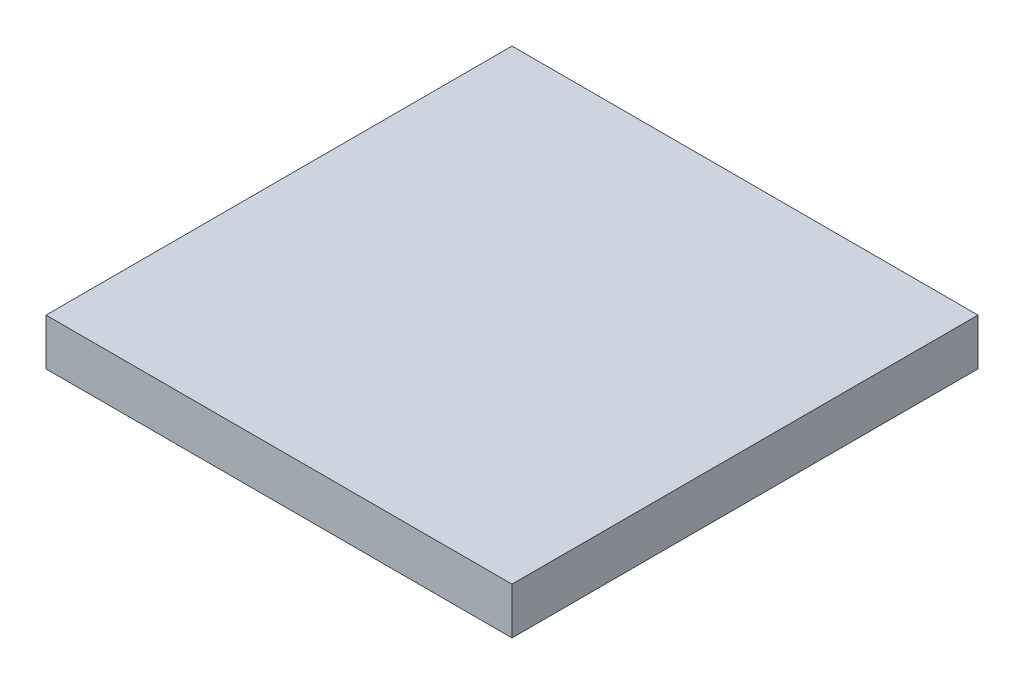
ISO-10303-21;
HEADER;
FILE_DESCRIPTION(('STEP AP214'),'2;1');
FILE_NAME('part.step','',(''),(''),'','','');
FILE_SCHEMA(('AUTOMOTIVE_DESIGN { 1 0 10303 214 1 1 1 1 }'));
ENDSEC;
DATA;
#1=APPLICATION_CONTEXT('core data for automotive mechanical design processes');
#2=APPLICATION_PROTOCOL_DEFINITION('international standard','automotive_design',2000,#1);
#3=PRODUCT_CONTEXT('',#1,'mechanical');
#4=PRODUCT('Part','Part','',(#3));
#5=PRODUCT_RELATED_PRODUCT_CATEGORY('part','',(#4));
#6=PRODUCT_DEFINITION_FORMATION('','',#4);
#7=PRODUCT_DEFINITION_CONTEXT('part definition',#1,'design');
#8=PRODUCT_DEFINITION('design','',#6,#7);
#9=PRODUCT_DEFINITION_SHAPE('','',#8);
#10=(LENGTH_UNIT() NAMED_UNIT(*) SI_UNIT(.MILLI.,.METRE.));
#11=(NAMED_UNIT(*) PLANE_ANGLE_UNIT() SI_UNIT($,.RADIAN.));
#12=(NAMED_UNIT(*) SI_UNIT($,.STERADIAN.) SOLID_ANGLE_UNIT());
#13=UNCERTAINTY_MEASURE_WITH_UNIT(LENGTH_MEASURE(1.E-05),#10,'distance_accuracy_value','');
#14=(GEOMETRIC_REPRESENTATION_CONTEXT(3) GLOBAL_UNCERTAINTY_ASSIGNED_CONTEXT((#13)) GLOBAL_UNIT_ASSIGNED_CONTEXT((#10,
#11,#12)) REPRESENTATION_CONTEXT('',''));
#15=CARTESIAN_POINT('',(0.,0.,0.));
#16=DIRECTION('',(0.,0.,1.));
#17=DIRECTION('',(1.,0.,0.));
#18=AXIS2_PLACEMENT_3D('',#15,#16,#17);
#19=CARTESIAN_POINT('',(-50.,10.,50.));
#20=DIRECTION('',(1.,0.,0.));
#21=DIRECTION('',(0.,0.,-1.));
#22=AXIS2_PLACEMENT_3D('',#19,#20,#21);
#23=PLANE('',#22);
#24=DIRECTION('',(0.,0.,1.));
#25=VECTOR('',#24,1.);
#26=CARTESIAN_POINT('',(-50.,0.,50.));
#27=LINE('',#26,#25);
#28=CARTESIAN_POINT('',(-50.,0.,-50.));
#29=VERTEX_POINT('',#28);
#30=CARTESIAN_POINT('',(-50.,0.,50.));
#31=VERTEX_POINT('',#30);
#32=EDGE_CURVE('E103',#29,#31,#27,.T.);
#33=ORIENTED_EDGE('',*,*,#32,.T.);
#34=DIRECTION('',(0.,-1.,0.));
#35=VECTOR('',#34,1.);
#36=CARTESIAN_POINT('',(-50.,10.,50.));
#37=LINE('',#36,#35);
#38=CARTESIAN_POINT('',(-50.,10.,50.));
#39=VERTEX_POINT('',#38);
#40=EDGE_CURVE('E11',#39,#31,#37,.T.);
#41=ORIENTED_EDGE('',*,*,#40,.F.);
#42=DIRECTION('',(0.,0.,1.));
#43=VECTOR('',#42,1.);
#44=CARTESIAN_POINT('',(-50.,10.,50.));
#45=LINE('',#44,#43);
#46=CARTESIAN_POINT('',(-50.,10.,-50.));
#47=VERTEX_POINT('',#46);
#48=EDGE_CURVE('E91',#47,#39,#45,.T.);
#49=ORIENTED_EDGE('',*,*,#48,.F.);
#50=DIRECTION('',(0.,-1.,0.));
#51=VECTOR('',#50,1.);
#52=CARTESIAN_POINT('',(-50.,10.,-50.));
#53=LINE('',#52,#51);
#54=EDGE_CURVE('E99',#47,#29,#53,.T.);
#55=ORIENTED_EDGE('',*,*,#54,.T.);
#56=EDGE_LOOP('',(#33,#41,#49,#55));
#57=FACE_BOUND('',#56,.T.);
#58=ADVANCED_FACE('F40',(#57),#23,.F.);
#59=CARTESIAN_POINT('',(50.,10.,50.));
#60=DIRECTION('',(0.,0.,-1.));
#61=DIRECTION('',(-1.,0.,0.));
#62=AXIS2_PLACEMENT_3D('',#59,#60,#61);
#63=PLANE('',#62);
#64=DIRECTION('',(1.,0.,0.));
#65=VECTOR('',#64,1.);
#66=CARTESIAN_POINT('',(50.,0.,50.));
#67=LINE('',#66,#65);
#68=CARTESIAN_POINT('',(50.,0.,50.));
#69=VERTEX_POINT('',#68);
#70=EDGE_CURVE('E95',#31,#69,#67,.T.);
#71=ORIENTED_EDGE('',*,*,#70,.T.);
#72=DIRECTION('',(0.,-1.,0.));
#73=VECTOR('',#72,1.);
#74=CARTESIAN_POINT('',(50.,10.,50.));
#75=LINE('',#74,#73);
#76=CARTESIAN_POINT('',(50.,10.,50.));
#77=VERTEX_POINT('',#76);
#78=EDGE_CURVE('E48',#77,#69,#75,.T.);
#79=ORIENTED_EDGE('',*,*,#78,.F.);
#80=DIRECTION('',(1.,0.,0.));
#81=VECTOR('',#80,1.);
#82=CARTESIAN_POINT('',(50.,10.,50.));
#83=LINE('',#82,#81);
#84=EDGE_CURVE('E86',#39,#77,#83,.T.);
#85=ORIENTED_EDGE('',*,*,#84,.F.);
#86=ORIENTED_EDGE('',*,*,#40,.T.);
#87=EDGE_LOOP('',(#71,#79,#85,#86));
#88=FACE_BOUND('',#87,.T.);
#89=ADVANCED_FACE('F94',(#88),#63,.F.);
#90=CARTESIAN_POINT('',(50.,10.,50.));
#91=DIRECTION('',(-1.,0.,0.));
#92=DIRECTION('',(0.,0.,1.));
#93=AXIS2_PLACEMENT_3D('',#90,#91,#92);
#94=PLANE('',#93);
#95=DIRECTION('',(0.,0.,-1.));
#96=VECTOR('',#95,1.);
#97=CARTESIAN_POINT('',(50.,0.,50.));
#98=LINE('',#97,#96);
#99=CARTESIAN_POINT('',(50.,0.,-50.));
#100=VERTEX_POINT('',#99);
#101=EDGE_CURVE('E73',#69,#100,#98,.T.);
#102=ORIENTED_EDGE('',*,*,#101,.T.);
#103=DIRECTION('',(0.,-1.,0.));
#104=VECTOR('',#103,1.);
#105=CARTESIAN_POINT('',(50.,10.,-50.));
#106=LINE('',#105,#104);
#107=CARTESIAN_POINT('',(50.,10.,-50.));
#108=VERTEX_POINT('',#107);
#109=EDGE_CURVE('E96',#108,#100,#106,.T.);
#110=ORIENTED_EDGE('',*,*,#109,.F.);
#111=DIRECTION('',(0.,0.,-1.));
#112=VECTOR('',#111,1.);
#113=CARTESIAN_POINT('',(50.,10.,50.));
#114=LINE('',#113,#112);
#115=EDGE_CURVE('E89',#77,#108,#114,.T.);
#116=ORIENTED_EDGE('',*,*,#115,.F.);
#117=ORIENTED_EDGE('',*,*,#78,.T.);
#118=EDGE_LOOP('',(#102,#110,#116,#117));
#119=FACE_BOUND('',#118,.T.);
#120=ADVANCED_FACE('F97',(#119),#94,.F.);
#121=CARTESIAN_POINT('',(50.,10.,-50.));
#122=DIRECTION('',(0.,0.,1.));
#123=DIRECTION('',(1.,0.,0.));
#124=AXIS2_PLACEMENT_3D('',#121,#122,#123);
#125=PLANE('',#124);
#126=DIRECTION('',(-1.,0.,0.));
#127=VECTOR('',#126,1.);
#128=CARTESIAN_POINT('',(50.,0.,-50.));
#129=LINE('',#128,#127);
#130=EDGE_CURVE('E79',#100,#29,#129,.T.);
#131=ORIENTED_EDGE('',*,*,#130,.T.);
#132=ORIENTED_EDGE('',*,*,#54,.F.);
#133=DIRECTION('',(-1.,0.,0.));
#134=VECTOR('',#133,1.);
#135=CARTESIAN_POINT('',(50.,10.,-50.));
#136=LINE('',#135,#134);
#137=EDGE_CURVE('E56',#108,#47,#136,.T.);
#138=ORIENTED_EDGE('',*,*,#137,.F.);
#139=ORIENTED_EDGE('',*,*,#109,.T.);
#140=EDGE_LOOP('',(#131,#132,#138,#139));
#141=FACE_BOUND('',#140,.T.);
#142=ADVANCED_FACE('F110',(#141),#125,.F.);
#143=CARTESIAN_POINT('',(0.,10.,0.));
#144=DIRECTION('',(0.,1.,0.));
#145=DIRECTION('',(0.,0.,1.));
#146=AXIS2_PLACEMENT_3D('',#143,#144,#145);
#147=PLANE('',#146);
#148=ORIENTED_EDGE('',*,*,#48,.T.);
#149=ORIENTED_EDGE('',*,*,#84,.T.);
#150=ORIENTED_EDGE('',*,*,#115,.T.);
#151=ORIENTED_EDGE('',*,*,#137,.T.);
#152=EDGE_LOOP('',(#148,#149,#150,#151));
#153=FACE_BOUND('',#152,.T.);
#154=ADVANCED_FACE('F87',(#153),#147,.T.);
#155=CARTESIAN_POINT('',(0.,0.,0.));
#156=DIRECTION('',(0.,1.,0.));
#157=DIRECTION('',(0.,0.,1.));
#158=AXIS2_PLACEMENT_3D('',#155,#156,#157);
#159=PLANE('',#158);
#160=ORIENTED_EDGE('',*,*,#32,.F.);
#161=ORIENTED_EDGE('',*,*,#130,.F.);
#162=ORIENTED_EDGE('',*,*,#101,.F.);
#163=ORIENTED_EDGE('',*,*,#70,.F.);
#164=EDGE_LOOP('',(#160,#161,#162,#163));
#165=FACE_BOUND('',#164,.T.);
#166=ADVANCED_FACE('F113',(#165),#159,.F.);
#167=CLOSED_SHELL('',(#58,#89,#120,#142,#154,#166));
#168=MANIFOLD_SOLID_BREP('B2',#167);
#169=ADVANCED_BREP_SHAPE_REPRESENTATION('',(#18,#168),#14);
#170=SHAPE_DEFINITION_REPRESENTATION(#9,#169);
ENDSEC;
END-ISO-10303-21;
